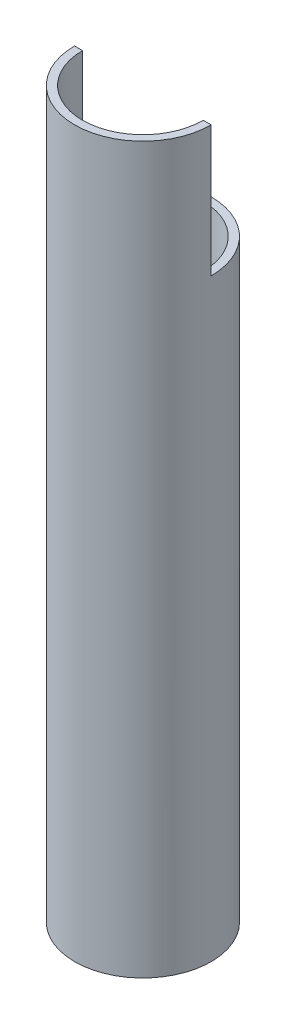
ISO-10303-21;
HEADER;
FILE_DESCRIPTION(('STEP AP214'),'2;1');
FILE_NAME('part.step','',(''),(''),'','','');
FILE_SCHEMA(('AUTOMOTIVE_DESIGN { 1 0 10303 214 1 1 1 1 }'));
ENDSEC;
DATA;
#1=APPLICATION_CONTEXT('core data for automotive mechanical design processes');
#2=APPLICATION_PROTOCOL_DEFINITION('international standard','automotive_design',2000,#1);
#3=PRODUCT_CONTEXT('',#1,'mechanical');
#4=PRODUCT('Part','Part','',(#3));
#5=PRODUCT_RELATED_PRODUCT_CATEGORY('part','',(#4));
#6=PRODUCT_DEFINITION_FORMATION('','',#4);
#7=PRODUCT_DEFINITION_CONTEXT('part definition',#1,'design');
#8=PRODUCT_DEFINITION('design','',#6,#7);
#9=PRODUCT_DEFINITION_SHAPE('','',#8);
#10=(LENGTH_UNIT() NAMED_UNIT(*) SI_UNIT(.MILLI.,.METRE.));
#11=(NAMED_UNIT(*) PLANE_ANGLE_UNIT() SI_UNIT($,.RADIAN.));
#12=(NAMED_UNIT(*) SI_UNIT($,.STERADIAN.) SOLID_ANGLE_UNIT());
#13=UNCERTAINTY_MEASURE_WITH_UNIT(LENGTH_MEASURE(1.E-05),#10,'distance_accuracy_value','');
#14=(GEOMETRIC_REPRESENTATION_CONTEXT(3) GLOBAL_UNCERTAINTY_ASSIGNED_CONTEXT((#13)) GLOBAL_UNIT_ASSIGNED_CONTEXT((#10,
#11,#12)) REPRESENTATION_CONTEXT('',''));
#15=CARTESIAN_POINT('',(0.,0.,0.));
#16=DIRECTION('',(0.,0.,1.));
#17=DIRECTION('',(1.,0.,0.));
#18=AXIS2_PLACEMENT_3D('',#15,#16,#17);
#19=CARTESIAN_POINT('',(0.,152.5,0.));
#20=DIRECTION('',(0.,1.,0.));
#21=DIRECTION('',(0.,0.,1.));
#22=AXIS2_PLACEMENT_3D('',#19,#20,#21);
#23=PLANE('',#22);
#24=DIRECTION('',(1.,0.,0.));
#25=VECTOR('',#24,1.);
#26=CARTESIAN_POINT('',(-14.375,152.5,0.));
#27=LINE('',#26,#25);
#28=CARTESIAN_POINT('',(-14.375,152.5,0.));
#29=VERTEX_POINT('',#28);
#30=CARTESIAN_POINT('',(-12.7,152.5,0.));
#31=VERTEX_POINT('',#30);
#32=EDGE_CURVE('E93',#29,#31,#27,.T.);
#33=ORIENTED_EDGE('',*,*,#32,.F.);
#34=CARTESIAN_POINT('',(0.,152.5,0.));
#35=DIRECTION('',(0.,1.,0.));
#36=DIRECTION('',(0.,0.,1.));
#37=AXIS2_PLACEMENT_3D('',#34,#35,#36);
#38=CIRCLE('',#37,14.375);
#39=CARTESIAN_POINT('',(14.375,152.5,0.));
#40=VERTEX_POINT('',#39);
#41=EDGE_CURVE('E90',#29,#40,#38,.T.);
#42=ORIENTED_EDGE('',*,*,#41,.T.);
#43=CARTESIAN_POINT('',(12.7,152.5,0.));
#44=VERTEX_POINT('',#43);
#45=EDGE_CURVE('E110',#44,#40,#27,.T.);
#46=ORIENTED_EDGE('',*,*,#45,.F.);
#47=CARTESIAN_POINT('',(0.,152.5,0.));
#48=DIRECTION('',(0.,1.,0.));
#49=DIRECTION('',(0.,0.,1.));
#50=AXIS2_PLACEMENT_3D('',#47,#48,#49);
#51=CIRCLE('',#50,12.7);
#52=EDGE_CURVE('E97',#31,#44,#51,.T.);
#53=ORIENTED_EDGE('',*,*,#52,.F.);
#54=EDGE_LOOP('',(#33,#42,#46,#53));
#55=FACE_BOUND('',#54,.T.);
#56=ADVANCED_FACE('F35',(#55),#23,.T.);
#57=CARTESIAN_POINT('',(0.,0.,0.));
#58=DIRECTION('',(0.,1.,0.));
#59=DIRECTION('',(0.,0.,1.));
#60=AXIS2_PLACEMENT_3D('',#57,#58,#59);
#61=PLANE('',#60);
#62=CARTESIAN_POINT('',(0.,0.,0.));
#63=DIRECTION('',(0.,1.,0.));
#64=DIRECTION('',(0.,0.,1.));
#65=AXIS2_PLACEMENT_3D('',#62,#63,#64);
#66=CIRCLE('',#65,14.375);
#67=CARTESIAN_POINT('',(0.,0.,14.375));
#68=VERTEX_POINT('',#67);
#69=EDGE_CURVE('E100',#68,#68,#66,.T.);
#70=ORIENTED_EDGE('',*,*,#69,.F.);
#71=EDGE_LOOP('',(#70));
#72=FACE_BOUND('',#71,.T.);
#73=CARTESIAN_POINT('',(0.,0.,0.));
#74=DIRECTION('',(0.,1.,0.));
#75=DIRECTION('',(0.,0.,1.));
#76=AXIS2_PLACEMENT_3D('',#73,#74,#75);
#77=CIRCLE('',#76,12.7);
#78=CARTESIAN_POINT('',(0.,0.,12.7));
#79=VERTEX_POINT('',#78);
#80=EDGE_CURVE('E96',#79,#79,#77,.T.);
#81=ORIENTED_EDGE('',*,*,#80,.T.);
#82=EDGE_LOOP('',(#81));
#83=FACE_BOUND('',#82,.T.);
#84=ADVANCED_FACE('F120',(#72,#83),#61,.F.);
#85=CARTESIAN_POINT('',(0.,152.5,0.));
#86=DIRECTION('',(0.,-1.,0.));
#87=DIRECTION('',(0.,0.,-1.));
#88=AXIS2_PLACEMENT_3D('',#85,#86,#87);
#89=CYLINDRICAL_SURFACE('',#88,14.375);
#90=ORIENTED_EDGE('',*,*,#41,.F.);
#91=DIRECTION('',(0.,1.,0.));
#92=VECTOR('',#91,1.);
#93=CARTESIAN_POINT('',(-14.375,125.,0.));
#94=LINE('',#93,#92);
#95=CARTESIAN_POINT('',(-14.375,125.,0.));
#96=VERTEX_POINT('',#95);
#97=EDGE_CURVE('E79',#96,#29,#94,.T.);
#98=ORIENTED_EDGE('',*,*,#97,.F.);
#99=CARTESIAN_POINT('',(0.,125.,0.));
#100=DIRECTION('',(0.,-1.,0.));
#101=DIRECTION('',(0.,0.,-1.));
#102=AXIS2_PLACEMENT_3D('',#99,#100,#101);
#103=CIRCLE('',#102,14.375);
#104=CARTESIAN_POINT('',(14.375,125.,0.));
#105=VERTEX_POINT('',#104);
#106=EDGE_CURVE('E74',#96,#105,#103,.T.);
#107=ORIENTED_EDGE('',*,*,#106,.T.);
#108=DIRECTION('',(0.,-1.,0.));
#109=VECTOR('',#108,1.);
#110=CARTESIAN_POINT('',(14.375,152.5,0.));
#111=LINE('',#110,#109);
#112=EDGE_CURVE('E57',#105,#40,#111,.F.);
#113=ORIENTED_EDGE('',*,*,#112,.T.);
#114=EDGE_LOOP('',(#90,#98,#107,#113));
#115=FACE_BOUND('',#114,.T.);
#116=ORIENTED_EDGE('',*,*,#69,.T.);
#117=EDGE_LOOP('',(#116));
#118=FACE_BOUND('',#117,.T.);
#119=ADVANCED_FACE('F37',(#115,#118),#89,.T.);
#120=CARTESIAN_POINT('',(0.,152.5,0.));
#121=DIRECTION('',(0.,-1.,0.));
#122=DIRECTION('',(0.,0.,-1.));
#123=AXIS2_PLACEMENT_3D('',#120,#121,#122);
#124=CYLINDRICAL_SURFACE('',#123,12.7);
#125=DIRECTION('',(0.,-1.,0.));
#126=VECTOR('',#125,1.);
#127=CARTESIAN_POINT('',(-12.7,152.5,0.));
#128=LINE('',#127,#126);
#129=CARTESIAN_POINT('',(-12.7,125.,0.));
#130=VERTEX_POINT('',#129);
#131=EDGE_CURVE('E11',#31,#130,#128,.T.);
#132=ORIENTED_EDGE('',*,*,#131,.F.);
#133=ORIENTED_EDGE('',*,*,#52,.T.);
#134=DIRECTION('',(0.,-1.,0.));
#135=VECTOR('',#134,1.);
#136=CARTESIAN_POINT('',(12.7,152.5,0.));
#137=LINE('',#136,#135);
#138=CARTESIAN_POINT('',(12.7,125.,0.));
#139=VERTEX_POINT('',#138);
#140=EDGE_CURVE('E43',#139,#44,#137,.F.);
#141=ORIENTED_EDGE('',*,*,#140,.F.);
#142=CARTESIAN_POINT('',(0.,125.,0.));
#143=DIRECTION('',(0.,-1.,0.));
#144=DIRECTION('',(0.,0.,-1.));
#145=AXIS2_PLACEMENT_3D('',#142,#143,#144);
#146=CIRCLE('',#145,12.7);
#147=EDGE_CURVE('E104',#130,#139,#146,.T.);
#148=ORIENTED_EDGE('',*,*,#147,.F.);
#149=EDGE_LOOP('',(#132,#133,#141,#148));
#150=FACE_BOUND('',#149,.T.);
#151=ORIENTED_EDGE('',*,*,#80,.F.);
#152=EDGE_LOOP('',(#151));
#153=FACE_BOUND('',#152,.T.);
#154=ADVANCED_FACE('F114',(#150,#153),#124,.F.);
#155=CARTESIAN_POINT('',(-14.375,125.,0.));
#156=DIRECTION('',(0.,0.,1.));
#157=DIRECTION('',(1.,0.,0.));
#158=AXIS2_PLACEMENT_3D('',#155,#156,#157);
#159=PLANE('',#158);
#160=DIRECTION('',(1.,0.,0.));
#161=VECTOR('',#160,1.);
#162=CARTESIAN_POINT('',(-14.375,125.,0.));
#163=LINE('',#162,#161);
#164=EDGE_CURVE('E76',#139,#105,#163,.T.);
#165=ORIENTED_EDGE('',*,*,#164,.F.);
#166=ORIENTED_EDGE('',*,*,#140,.T.);
#167=ORIENTED_EDGE('',*,*,#45,.T.);
#168=ORIENTED_EDGE('',*,*,#112,.F.);
#169=EDGE_LOOP('',(#165,#166,#167,#168));
#170=FACE_BOUND('',#169,.T.);
#171=ADVANCED_FACE('F109',(#170),#159,.F.);
#172=ORIENTED_EDGE('',*,*,#131,.T.);
#173=EDGE_CURVE('E50',#96,#130,#163,.T.);
#174=ORIENTED_EDGE('',*,*,#173,.F.);
#175=ORIENTED_EDGE('',*,*,#97,.T.);
#176=ORIENTED_EDGE('',*,*,#32,.T.);
#177=EDGE_LOOP('',(#172,#174,#175,#176));
#178=FACE_BOUND('',#177,.T.);
#179=ADVANCED_FACE('F82',(#178),#159,.F.);
#180=CARTESIAN_POINT('',(0.,125.,0.));
#181=DIRECTION('',(0.,-1.,0.));
#182=DIRECTION('',(0.,0.,-1.));
#183=AXIS2_PLACEMENT_3D('',#180,#181,#182);
#184=PLANE('',#183);
#185=ORIENTED_EDGE('',*,*,#173,.T.);
#186=ORIENTED_EDGE('',*,*,#147,.T.);
#187=ORIENTED_EDGE('',*,*,#164,.T.);
#188=ORIENTED_EDGE('',*,*,#106,.F.);
#189=EDGE_LOOP('',(#185,#186,#187,#188));
#190=FACE_BOUND('',#189,.T.);
#191=ADVANCED_FACE('F75',(#190),#184,.F.);
#192=CLOSED_SHELL('',(#56,#84,#119,#154,#171,#179,#191));
#193=MANIFOLD_SOLID_BREP('B2',#192);
#194=ADVANCED_BREP_SHAPE_REPRESENTATION('',(#18,#193),#14);
#195=SHAPE_DEFINITION_REPRESENTATION(#9,#194);
ENDSEC;
END-ISO-10303-21;
